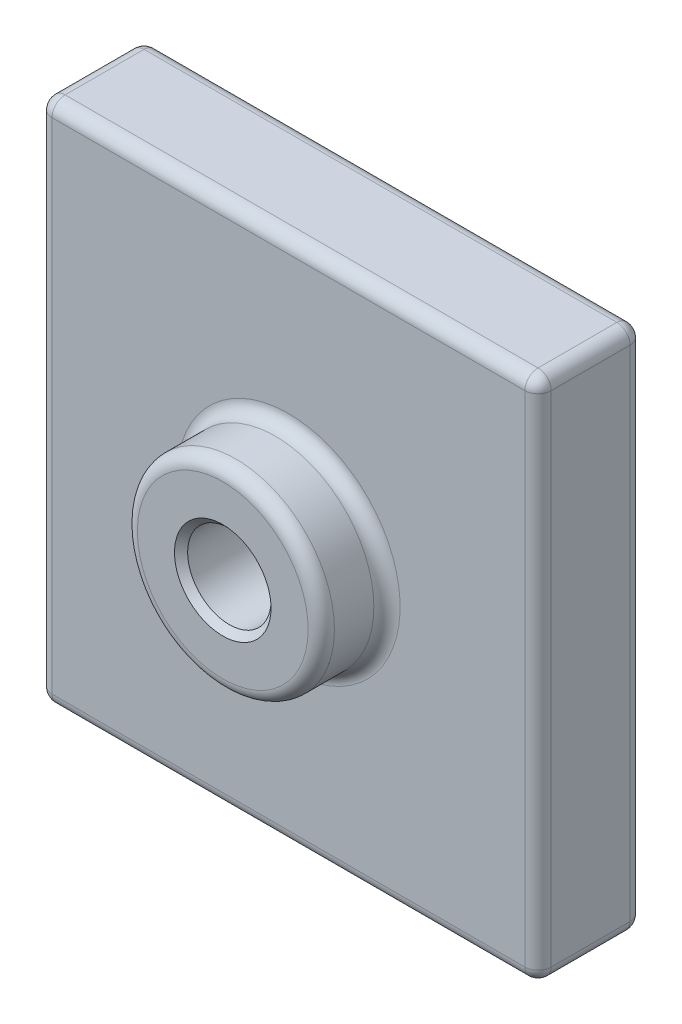
ISO-10303-21;
HEADER;
FILE_DESCRIPTION(('STEP AP214'),'2;1');
FILE_NAME('part.step','',(''),(''),'','','');
FILE_SCHEMA(('AUTOMOTIVE_DESIGN { 1 0 10303 214 1 1 1 1 }'));
ENDSEC;
DATA;
#1=APPLICATION_CONTEXT('core data for automotive mechanical design processes');
#2=APPLICATION_PROTOCOL_DEFINITION('international standard','automotive_design',2000,#1);
#3=PRODUCT_CONTEXT('',#1,'mechanical');
#4=PRODUCT('Part','Part','',(#3));
#5=PRODUCT_RELATED_PRODUCT_CATEGORY('part','',(#4));
#6=PRODUCT_DEFINITION_FORMATION('','',#4);
#7=PRODUCT_DEFINITION_CONTEXT('part definition',#1,'design');
#8=PRODUCT_DEFINITION('design','',#6,#7);
#9=PRODUCT_DEFINITION_SHAPE('','',#8);
#10=(LENGTH_UNIT() NAMED_UNIT(*) SI_UNIT(.MILLI.,.METRE.));
#11=(NAMED_UNIT(*) PLANE_ANGLE_UNIT() SI_UNIT($,.RADIAN.));
#12=(NAMED_UNIT(*) SI_UNIT($,.STERADIAN.) SOLID_ANGLE_UNIT());
#13=UNCERTAINTY_MEASURE_WITH_UNIT(LENGTH_MEASURE(1.E-05),#10,'distance_accuracy_value','');
#14=(GEOMETRIC_REPRESENTATION_CONTEXT(3) GLOBAL_UNCERTAINTY_ASSIGNED_CONTEXT((#13)) GLOBAL_UNIT_ASSIGNED_CONTEXT((#10,
#11,#12)) REPRESENTATION_CONTEXT('',''));
#15=CARTESIAN_POINT('',(0.,0.,0.));
#16=DIRECTION('',(0.,0.,1.));
#17=DIRECTION('',(1.,0.,0.));
#18=AXIS2_PLACEMENT_3D('',#15,#16,#17);
#19=CARTESIAN_POINT('',(0.,0.,8.));
#20=DIRECTION('',(1.,0.,0.));
#21=DIRECTION('',(0.,0.,-1.));
#22=AXIS2_PLACEMENT_3D('',#19,#20,#21);
#23=PLANE('',#22);
#24=DIRECTION('',(0.,0.,-1.));
#25=VECTOR('',#24,1.);
#26=CARTESIAN_POINT('',(0.,39.,8.));
#27=LINE('',#26,#25);
#28=CARTESIAN_POINT('',(0.,39.,7.));
#29=VERTEX_POINT('',#28);
#30=CARTESIAN_POINT('',(0.,39.,1.));
#31=VERTEX_POINT('',#30);
#32=EDGE_CURVE('E320',#29,#31,#27,.T.);
#33=ORIENTED_EDGE('',*,*,#32,.T.);
#34=DIRECTION('',(0.,-1.,0.));
#35=VECTOR('',#34,1.);
#36=CARTESIAN_POINT('',(0.,0.,1.));
#37=LINE('',#36,#35);
#38=CARTESIAN_POINT('',(0.,1.,1.));
#39=VERTEX_POINT('',#38);
#40=EDGE_CURVE('E324',#31,#39,#37,.T.);
#41=ORIENTED_EDGE('',*,*,#40,.T.);
#42=DIRECTION('',(0.,0.,-1.));
#43=VECTOR('',#42,1.);
#44=CARTESIAN_POINT('',(0.,1.,8.));
#45=LINE('',#44,#43);
#46=CARTESIAN_POINT('',(0.,1.,7.));
#47=VERTEX_POINT('',#46);
#48=EDGE_CURVE('E317',#39,#47,#45,.F.);
#49=ORIENTED_EDGE('',*,*,#48,.T.);
#50=DIRECTION('',(0.,-1.,0.));
#51=VECTOR('',#50,1.);
#52=CARTESIAN_POINT('',(0.,0.,7.));
#53=LINE('',#52,#51);
#54=EDGE_CURVE('E314',#47,#29,#53,.F.);
#55=ORIENTED_EDGE('',*,*,#54,.T.);
#56=EDGE_LOOP('',(#33,#41,#49,#55));
#57=FACE_BOUND('',#56,.T.);
#58=ADVANCED_FACE('F41',(#57),#23,.F.);
#59=CARTESIAN_POINT('',(0.,0.,8.));
#60=DIRECTION('',(0.,1.,0.));
#61=DIRECTION('',(0.,0.,1.));
#62=AXIS2_PLACEMENT_3D('',#59,#60,#61);
#63=PLANE('',#62);
#64=DIRECTION('',(0.,0.,-1.));
#65=VECTOR('',#64,1.);
#66=CARTESIAN_POINT('',(1.,0.,8.));
#67=LINE('',#66,#65);
#68=CARTESIAN_POINT('',(1.,0.,7.));
#69=VERTEX_POINT('',#68);
#70=CARTESIAN_POINT('',(1.,0.,1.));
#71=VERTEX_POINT('',#70);
#72=EDGE_CURVE('E265',#69,#71,#67,.T.);
#73=ORIENTED_EDGE('',*,*,#72,.T.);
#74=DIRECTION('',(1.,0.,0.));
#75=VECTOR('',#74,1.);
#76=CARTESIAN_POINT('',(38.,0.,1.));
#77=LINE('',#76,#75);
#78=CARTESIAN_POINT('',(37.,0.,1.));
#79=VERTEX_POINT('',#78);
#80=EDGE_CURVE('E271',#71,#79,#77,.T.);
#81=ORIENTED_EDGE('',*,*,#80,.T.);
#82=DIRECTION('',(0.,0.,-1.));
#83=VECTOR('',#82,1.);
#84=CARTESIAN_POINT('',(37.,0.,8.));
#85=LINE('',#84,#83);
#86=CARTESIAN_POINT('',(37.,0.,7.));
#87=VERTEX_POINT('',#86);
#88=EDGE_CURVE('E268',#79,#87,#85,.F.);
#89=ORIENTED_EDGE('',*,*,#88,.T.);
#90=DIRECTION('',(1.,0.,0.));
#91=VECTOR('',#90,1.);
#92=CARTESIAN_POINT('',(0.,0.,7.));
#93=LINE('',#92,#91);
#94=EDGE_CURVE('E262',#87,#69,#93,.F.);
#95=ORIENTED_EDGE('',*,*,#94,.T.);
#96=EDGE_LOOP('',(#73,#81,#89,#95));
#97=FACE_BOUND('',#96,.T.);
#98=ADVANCED_FACE('F536',(#97),#63,.F.);
#99=CARTESIAN_POINT('',(38.,0.,8.));
#100=DIRECTION('',(-1.,0.,0.));
#101=DIRECTION('',(0.,0.,1.));
#102=AXIS2_PLACEMENT_3D('',#99,#100,#101);
#103=PLANE('',#102);
#104=DIRECTION('',(0.,0.,-1.));
#105=VECTOR('',#104,1.);
#106=CARTESIAN_POINT('',(38.,1.,8.));
#107=LINE('',#106,#105);
#108=CARTESIAN_POINT('',(38.,1.,7.));
#109=VERTEX_POINT('',#108);
#110=CARTESIAN_POINT('',(38.,1.,1.));
#111=VERTEX_POINT('',#110);
#112=EDGE_CURVE('E307',#109,#111,#107,.T.);
#113=ORIENTED_EDGE('',*,*,#112,.T.);
#114=DIRECTION('',(0.,1.,0.));
#115=VECTOR('',#114,1.);
#116=CARTESIAN_POINT('',(38.,40.,1.));
#117=LINE('',#116,#115);
#118=CARTESIAN_POINT('',(38.,39.,1.));
#119=VERTEX_POINT('',#118);
#120=EDGE_CURVE('E311',#111,#119,#117,.T.);
#121=ORIENTED_EDGE('',*,*,#120,.T.);
#122=DIRECTION('',(0.,0.,-1.));
#123=VECTOR('',#122,1.);
#124=CARTESIAN_POINT('',(38.,39.,8.));
#125=LINE('',#124,#123);
#126=CARTESIAN_POINT('',(38.,39.,7.));
#127=VERTEX_POINT('',#126);
#128=EDGE_CURVE('E304',#119,#127,#125,.F.);
#129=ORIENTED_EDGE('',*,*,#128,.T.);
#130=DIRECTION('',(0.,1.,0.));
#131=VECTOR('',#130,1.);
#132=CARTESIAN_POINT('',(38.,0.,7.));
#133=LINE('',#132,#131);
#134=EDGE_CURVE('E301',#127,#109,#133,.F.);
#135=ORIENTED_EDGE('',*,*,#134,.T.);
#136=EDGE_LOOP('',(#113,#121,#129,#135));
#137=FACE_BOUND('',#136,.T.);
#138=ADVANCED_FACE('F542',(#137),#103,.F.);
#139=CARTESIAN_POINT('',(0.,40.,8.));
#140=DIRECTION('',(0.,-1.,0.));
#141=DIRECTION('',(0.,0.,-1.));
#142=AXIS2_PLACEMENT_3D('',#139,#140,#141);
#143=PLANE('',#142);
#144=DIRECTION('',(0.,0.,-1.));
#145=VECTOR('',#144,1.);
#146=CARTESIAN_POINT('',(37.,40.,8.));
#147=LINE('',#146,#145);
#148=CARTESIAN_POINT('',(37.,40.,7.));
#149=VERTEX_POINT('',#148);
#150=CARTESIAN_POINT('',(37.,40.,1.));
#151=VERTEX_POINT('',#150);
#152=EDGE_CURVE('E294',#149,#151,#147,.T.);
#153=ORIENTED_EDGE('',*,*,#152,.T.);
#154=DIRECTION('',(-1.,0.,0.));
#155=VECTOR('',#154,1.);
#156=CARTESIAN_POINT('',(0.,40.,1.));
#157=LINE('',#156,#155);
#158=CARTESIAN_POINT('',(1.,40.,1.));
#159=VERTEX_POINT('',#158);
#160=EDGE_CURVE('E297',#151,#159,#157,.T.);
#161=ORIENTED_EDGE('',*,*,#160,.T.);
#162=DIRECTION('',(0.,0.,-1.));
#163=VECTOR('',#162,1.);
#164=CARTESIAN_POINT('',(1.,40.,8.));
#165=LINE('',#164,#163);
#166=CARTESIAN_POINT('',(1.,40.,7.));
#167=VERTEX_POINT('',#166);
#168=EDGE_CURVE('E291',#159,#167,#165,.F.);
#169=ORIENTED_EDGE('',*,*,#168,.T.);
#170=DIRECTION('',(-1.,0.,0.));
#171=VECTOR('',#170,1.);
#172=CARTESIAN_POINT('',(0.,40.,7.));
#173=LINE('',#172,#171);
#174=EDGE_CURVE('E288',#167,#149,#173,.F.);
#175=ORIENTED_EDGE('',*,*,#174,.T.);
#176=EDGE_LOOP('',(#153,#161,#169,#175));
#177=FACE_BOUND('',#176,.T.);
#178=ADVANCED_FACE('F680',(#177),#143,.F.);
#179=CARTESIAN_POINT('',(0.,0.,8.));
#180=DIRECTION('',(0.,0.,-1.));
#181=DIRECTION('',(-1.,0.,0.));
#182=AXIS2_PLACEMENT_3D('',#179,#180,#181);
#183=PLANE('',#182);
#184=DIRECTION('',(0.,1.,0.));
#185=VECTOR('',#184,1.);
#186=CARTESIAN_POINT('',(37.,0.,8.));
#187=LINE('',#186,#185);
#188=CARTESIAN_POINT('',(37.,1.,8.));
#189=VERTEX_POINT('',#188);
#190=CARTESIAN_POINT('',(37.,39.,8.));
#191=VERTEX_POINT('',#190);
#192=EDGE_CURVE('E337',#189,#191,#187,.T.);
#193=ORIENTED_EDGE('',*,*,#192,.T.);
#194=DIRECTION('',(-1.,0.,0.));
#195=VECTOR('',#194,1.);
#196=CARTESIAN_POINT('',(0.,39.,8.));
#197=LINE('',#196,#195);
#198=CARTESIAN_POINT('',(1.,39.,8.));
#199=VERTEX_POINT('',#198);
#200=EDGE_CURVE('E340',#191,#199,#197,.T.);
#201=ORIENTED_EDGE('',*,*,#200,.T.);
#202=DIRECTION('',(0.,-1.,0.));
#203=VECTOR('',#202,1.);
#204=CARTESIAN_POINT('',(1.,0.,8.));
#205=LINE('',#204,#203);
#206=CARTESIAN_POINT('',(1.,1.,8.));
#207=VERTEX_POINT('',#206);
#208=EDGE_CURVE('E331',#199,#207,#205,.T.);
#209=ORIENTED_EDGE('',*,*,#208,.T.);
#210=DIRECTION('',(1.,0.,0.));
#211=VECTOR('',#210,1.);
#212=CARTESIAN_POINT('',(0.,1.,8.));
#213=LINE('',#212,#211);
#214=EDGE_CURVE('E334',#207,#189,#213,.T.);
#215=ORIENTED_EDGE('',*,*,#214,.T.);
#216=EDGE_LOOP('',(#193,#201,#209,#215));
#217=FACE_BOUND('',#216,.T.);
#218=CARTESIAN_POINT('',(19.,20.,8.));
#219=DIRECTION('',(0.,0.,-1.));
#220=DIRECTION('',(-1.,0.,0.));
#221=AXIS2_PLACEMENT_3D('',#218,#219,#220);
#222=CIRCLE('',#221,8.5);
#223=CARTESIAN_POINT('',(10.5,20.,8.));
#224=VERTEX_POINT('',#223);
#225=EDGE_CURVE('E327',#224,#224,#222,.T.);
#226=ORIENTED_EDGE('',*,*,#225,.T.);
#227=EDGE_LOOP('',(#226));
#228=FACE_BOUND('',#227,.T.);
#229=ADVANCED_FACE('F677',(#217,#228),#183,.F.);
#230=CARTESIAN_POINT('',(0.,0.,0.));
#231=DIRECTION('',(0.,0.,-1.));
#232=DIRECTION('',(-1.,0.,0.));
#233=AXIS2_PLACEMENT_3D('',#230,#231,#232);
#234=PLANE('',#233);
#235=DIRECTION('',(-0.5,0.866025403784439,0.));
#236=VECTOR('',#235,1.);
#237=CARTESIAN_POINT('',(22.6409151350771,25.80625,0.));
#238=LINE('',#237,#236);
#239=CARTESIAN_POINT('',(25.9931551355594,20.,0.));
#240=VERTEX_POINT('',#239);
#241=CARTESIAN_POINT('',(22.4965775677797,26.05625,0.));
#242=VERTEX_POINT('',#241);
#243=EDGE_CURVE('E449',#240,#242,#238,.T.);
#244=ORIENTED_EDGE('',*,*,#243,.T.);
#245=DIRECTION('',(-1.,0.,0.));
#246=VECTOR('',#245,1.);
#247=CARTESIAN_POINT('',(15.7920975668151,26.05625,0.));
#248=LINE('',#247,#246);
#249=CARTESIAN_POINT('',(15.5034224322203,26.05625,0.));
#250=VERTEX_POINT('',#249);
#251=EDGE_CURVE('E452',#242,#250,#248,.T.);
#252=ORIENTED_EDGE('',*,*,#251,.T.);
#253=DIRECTION('',(-0.5,-0.866025403784438,0.));
#254=VECTOR('',#253,1.);
#255=CARTESIAN_POINT('',(12.1511824317381,20.25,0.));
#256=LINE('',#255,#254);
#257=CARTESIAN_POINT('',(12.0068448644406,20.,0.));
#258=VERTEX_POINT('',#257);
#259=EDGE_CURVE('E437',#250,#258,#256,.T.);
#260=ORIENTED_EDGE('',*,*,#259,.T.);
#261=DIRECTION('',(0.5,-0.866025403784438,0.));
#262=VECTOR('',#261,1.);
#263=CARTESIAN_POINT('',(15.3590848649229,14.19375,0.));
#264=LINE('',#263,#262);
#265=CARTESIAN_POINT('',(15.5034224322203,13.94375,0.));
#266=VERTEX_POINT('',#265);
#267=EDGE_CURVE('E440',#258,#266,#264,.T.);
#268=ORIENTED_EDGE('',*,*,#267,.T.);
#269=DIRECTION('',(1.,0.,0.));
#270=VECTOR('',#269,1.);
#271=CARTESIAN_POINT('',(22.2079024331849,13.94375,0.));
#272=LINE('',#271,#270);
#273=CARTESIAN_POINT('',(22.4965775677797,13.94375,0.));
#274=VERTEX_POINT('',#273);
#275=EDGE_CURVE('E443',#266,#274,#272,.T.);
#276=ORIENTED_EDGE('',*,*,#275,.T.);
#277=DIRECTION('',(0.5,0.866025403784438,0.));
#278=VECTOR('',#277,1.);
#279=CARTESIAN_POINT('',(25.8488175682619,19.75,0.));
#280=LINE('',#279,#278);
#281=EDGE_CURVE('E446',#274,#240,#280,.T.);
#282=ORIENTED_EDGE('',*,*,#281,.T.);
#283=EDGE_LOOP('',(#244,#252,#260,#268,#276,#282));
#284=FACE_BOUND('',#283,.T.);
#285=DIRECTION('',(-1.,0.,0.));
#286=VECTOR('',#285,1.);
#287=CARTESIAN_POINT('',(38.,39.,0.));
#288=LINE('',#287,#286);
#289=CARTESIAN_POINT('',(1.,39.,0.));
#290=VERTEX_POINT('',#289);
#291=CARTESIAN_POINT('',(37.,39.,0.));
#292=VERTEX_POINT('',#291);
#293=EDGE_CURVE('E278',#290,#292,#288,.F.);
#294=ORIENTED_EDGE('',*,*,#293,.T.);
#295=DIRECTION('',(0.,1.,0.));
#296=VECTOR('',#295,1.);
#297=CARTESIAN_POINT('',(37.,0.,0.));
#298=LINE('',#297,#296);
#299=CARTESIAN_POINT('',(37.,1.,0.));
#300=VERTEX_POINT('',#299);
#301=EDGE_CURVE('E285',#292,#300,#298,.F.);
#302=ORIENTED_EDGE('',*,*,#301,.T.);
#303=DIRECTION('',(1.,0.,0.));
#304=VECTOR('',#303,1.);
#305=CARTESIAN_POINT('',(0.,1.,0.));
#306=LINE('',#305,#304);
#307=CARTESIAN_POINT('',(1.,1.,0.));
#308=VERTEX_POINT('',#307);
#309=EDGE_CURVE('E281',#300,#308,#306,.F.);
#310=ORIENTED_EDGE('',*,*,#309,.T.);
#311=DIRECTION('',(0.,-1.,0.));
#312=VECTOR('',#311,1.);
#313=CARTESIAN_POINT('',(1.,40.,0.));
#314=LINE('',#313,#312);
#315=EDGE_CURVE('E275',#308,#290,#314,.F.);
#316=ORIENTED_EDGE('',*,*,#315,.T.);
#317=EDGE_LOOP('',(#294,#302,#310,#316));
#318=FACE_BOUND('',#317,.T.);
#319=ADVANCED_FACE('F674',(#284,#318),#234,.T.);
#320=CARTESIAN_POINT('',(19.,20.,13.));
#321=DIRECTION('',(0.,0.,1.));
#322=DIRECTION('',(1.,0.,0.));
#323=AXIS2_PLACEMENT_3D('',#320,#321,#322);
#324=PLANE('',#323);
#325=CARTESIAN_POINT('',(19.,20.,13.));
#326=DIRECTION('',(0.,0.,1.));
#327=DIRECTION('',(1.,0.,0.));
#328=AXIS2_PLACEMENT_3D('',#325,#326,#327);
#329=CIRCLE('',#328,3.675);
#330=CARTESIAN_POINT('',(22.675,20.,13.));
#331=VERTEX_POINT('',#330);
#332=EDGE_CURVE('E51',#331,#331,#329,.F.);
#333=ORIENTED_EDGE('',*,*,#332,.T.);
#334=EDGE_LOOP('',(#333));
#335=FACE_BOUND('',#334,.T.);
#336=CARTESIAN_POINT('',(19.,20.,13.));
#337=DIRECTION('',(0.,0.,1.));
#338=DIRECTION('',(1.,0.,0.));
#339=AXIS2_PLACEMENT_3D('',#336,#337,#338);
#340=CIRCLE('',#339,6.5);
#341=CARTESIAN_POINT('',(25.5,20.,13.));
#342=VERTEX_POINT('',#341);
#343=EDGE_CURVE('E249',#342,#342,#340,.T.);
#344=ORIENTED_EDGE('',*,*,#343,.T.);
#345=EDGE_LOOP('',(#344));
#346=FACE_BOUND('',#345,.T.);
#347=ADVANCED_FACE('F668',(#335,#346),#324,.T.);
#348=CARTESIAN_POINT('',(19.,20.,13.));
#349=DIRECTION('',(0.,0.,-1.));
#350=DIRECTION('',(-1.,0.,0.));
#351=AXIS2_PLACEMENT_3D('',#348,#349,#350);
#352=CYLINDRICAL_SURFACE('',#351,7.5);
#353=CARTESIAN_POINT('',(19.,20.,12.));
#354=DIRECTION('',(0.,0.,1.));
#355=DIRECTION('',(1.,0.,0.));
#356=AXIS2_PLACEMENT_3D('',#353,#354,#355);
#357=CIRCLE('',#356,7.5);
#358=CARTESIAN_POINT('',(26.5,20.,12.));
#359=VERTEX_POINT('',#358);
#360=EDGE_CURVE('E258',#359,#359,#357,.F.);
#361=ORIENTED_EDGE('',*,*,#360,.T.);
#362=EDGE_LOOP('',(#361));
#363=FACE_BOUND('',#362,.T.);
#364=CARTESIAN_POINT('',(19.,20.,9.));
#365=DIRECTION('',(0.,0.,-1.));
#366=DIRECTION('',(-1.,0.,0.));
#367=AXIS2_PLACEMENT_3D('',#364,#365,#366);
#368=CIRCLE('',#367,7.5);
#369=CARTESIAN_POINT('',(11.5,20.,9.));
#370=VERTEX_POINT('',#369);
#371=EDGE_CURVE('E253',#370,#370,#368,.F.);
#372=ORIENTED_EDGE('',*,*,#371,.T.);
#373=EDGE_LOOP('',(#372));
#374=FACE_BOUND('',#373,.T.);
#375=ADVANCED_FACE('F661',(#363,#374),#352,.T.);
#376=CARTESIAN_POINT('',(19.,20.,13.));
#377=DIRECTION('',(0.,0.,-1.));
#378=DIRECTION('',(-1.,0.,0.));
#379=AXIS2_PLACEMENT_3D('',#376,#377,#378);
#380=CYLINDRICAL_SURFACE('',#379,3.175);
#381=CARTESIAN_POINT('',(19.,20.,12.5));
#382=DIRECTION('',(0.,0.,1.));
#383=DIRECTION('',(1.,0.,0.));
#384=AXIS2_PLACEMENT_3D('',#381,#382,#383);
#385=CIRCLE('',#384,3.175);
#386=CARTESIAN_POINT('',(22.175,20.,12.5));
#387=VERTEX_POINT('',#386);
#388=EDGE_CURVE('E472',#387,#387,#385,.T.);
#389=ORIENTED_EDGE('',*,*,#388,.T.);
#390=EDGE_LOOP('',(#389));
#391=FACE_BOUND('',#390,.T.);
#392=CARTESIAN_POINT('',(19.,20.,6.05624999999999));
#393=DIRECTION('',(0.,0.,-1.));
#394=DIRECTION('',(-1.,0.,0.));
#395=AXIS2_PLACEMENT_3D('',#392,#393,#394);
#396=CIRCLE('',#395,3.175);
#397=CARTESIAN_POINT('',(15.825,20.,6.05624999999999));
#398=VERTEX_POINT('',#397);
#399=EDGE_CURVE('E468',#398,#398,#396,.T.);
#400=ORIENTED_EDGE('',*,*,#399,.T.);
#401=EDGE_LOOP('',(#400));
#402=FACE_BOUND('',#401,.T.);
#403=ADVANCED_FACE('F551',(#391,#402),#380,.F.);
#404=CARTESIAN_POINT('',(19.,20.,12.));
#405=DIRECTION('',(0.,0.,1.));
#406=DIRECTION('',(1.,0.,0.));
#407=AXIS2_PLACEMENT_3D('',#404,#405,#406);
#408=TOROIDAL_SURFACE('',#407,6.5,1.);
#409=ORIENTED_EDGE('',*,*,#360,.F.);
#410=EDGE_LOOP('',(#409));
#411=FACE_BOUND('',#410,.T.);
#412=ORIENTED_EDGE('',*,*,#343,.F.);
#413=EDGE_LOOP('',(#412));
#414=FACE_BOUND('',#413,.T.);
#415=ADVANCED_FACE('F547',(#411,#414),#408,.T.);
#416=CARTESIAN_POINT('',(0.,39.,7.));
#417=DIRECTION('',(-1.,0.,0.));
#418=DIRECTION('',(0.,0.,1.));
#419=AXIS2_PLACEMENT_3D('',#416,#417,#418);
#420=CYLINDRICAL_SURFACE('',#419,1.);
#421=CARTESIAN_POINT('',(1.,39.,7.));
#422=DIRECTION('',(-1.,0.,0.));
#423=DIRECTION('',(0.,0.,1.));
#424=AXIS2_PLACEMENT_3D('',#421,#422,#423);
#425=CIRCLE('',#424,1.);
#426=EDGE_CURVE('E254',#199,#167,#425,.T.);
#427=ORIENTED_EDGE('',*,*,#426,.F.);
#428=ORIENTED_EDGE('',*,*,#200,.F.);
#429=CARTESIAN_POINT('',(37.,39.,7.));
#430=DIRECTION('',(1.,0.,0.));
#431=DIRECTION('',(0.,0.,-1.));
#432=AXIS2_PLACEMENT_3D('',#429,#430,#431);
#433=CIRCLE('',#432,1.);
#434=EDGE_CURVE('E428',#149,#191,#433,.T.);
#435=ORIENTED_EDGE('',*,*,#434,.F.);
#436=ORIENTED_EDGE('',*,*,#174,.F.);
#437=EDGE_LOOP('',(#427,#428,#435,#436));
#438=FACE_BOUND('',#437,.T.);
#439=ADVANCED_FACE('F550',(#438),#420,.T.);
#440=CARTESIAN_POINT('',(1.,39.,7.));
#441=DIRECTION('',(0.,0.,1.));
#442=DIRECTION('',(1.,0.,0.));
#443=AXIS2_PLACEMENT_3D('',#440,#441,#442);
#444=SPHERICAL_SURFACE('',#443,1.);
#445=CARTESIAN_POINT('',(1.,39.,7.));
#446=DIRECTION('',(0.,1.,0.));
#447=DIRECTION('',(0.,0.,1.));
#448=AXIS2_PLACEMENT_3D('',#445,#446,#447);
#449=CIRCLE('',#448,1.);
#450=EDGE_CURVE('E420',#199,#29,#449,.F.);
#451=ORIENTED_EDGE('',*,*,#450,.F.);
#452=ORIENTED_EDGE('',*,*,#426,.T.);
#453=CARTESIAN_POINT('',(1.,39.,7.));
#454=DIRECTION('',(0.,0.,1.));
#455=DIRECTION('',(1.,0.,0.));
#456=AXIS2_PLACEMENT_3D('',#453,#454,#455);
#457=CIRCLE('',#456,1.);
#458=EDGE_CURVE('E424',#29,#167,#457,.F.);
#459=ORIENTED_EDGE('',*,*,#458,.F.);
#460=EDGE_LOOP('',(#451,#452,#459));
#461=FACE_BOUND('',#460,.T.);
#462=ADVANCED_FACE('F624',(#461),#444,.T.);
#463=CARTESIAN_POINT('',(37.,39.,7.));
#464=DIRECTION('',(0.,0.,1.));
#465=DIRECTION('',(1.,0.,0.));
#466=AXIS2_PLACEMENT_3D('',#463,#464,#465);
#467=SPHERICAL_SURFACE('',#466,1.);
#468=CARTESIAN_POINT('',(37.,39.,7.));
#469=DIRECTION('',(0.,0.,1.));
#470=DIRECTION('',(1.,0.,0.));
#471=AXIS2_PLACEMENT_3D('',#468,#469,#470);
#472=CIRCLE('',#471,1.);
#473=EDGE_CURVE('E412',#149,#127,#472,.F.);
#474=ORIENTED_EDGE('',*,*,#473,.F.);
#475=ORIENTED_EDGE('',*,*,#434,.T.);
#476=CARTESIAN_POINT('',(37.,39.,7.));
#477=DIRECTION('',(0.,1.,0.));
#478=DIRECTION('',(0.,0.,1.));
#479=AXIS2_PLACEMENT_3D('',#476,#477,#478);
#480=CIRCLE('',#479,1.);
#481=EDGE_CURVE('E416',#127,#191,#480,.F.);
#482=ORIENTED_EDGE('',*,*,#481,.F.);
#483=EDGE_LOOP('',(#474,#475,#482));
#484=FACE_BOUND('',#483,.T.);
#485=ADVANCED_FACE('F620',(#484),#467,.T.);
#486=CARTESIAN_POINT('',(1.,39.,8.));
#487=DIRECTION('',(0.,0.,-1.));
#488=DIRECTION('',(-1.,0.,0.));
#489=AXIS2_PLACEMENT_3D('',#486,#487,#488);
#490=CYLINDRICAL_SURFACE('',#489,1.);
#491=ORIENTED_EDGE('',*,*,#458,.T.);
#492=ORIENTED_EDGE('',*,*,#168,.F.);
#493=CARTESIAN_POINT('',(1.,39.,1.));
#494=DIRECTION('',(0.,0.,-1.));
#495=DIRECTION('',(-1.,0.,0.));
#496=AXIS2_PLACEMENT_3D('',#493,#494,#495);
#497=CIRCLE('',#496,1.);
#498=EDGE_CURVE('E405',#31,#159,#497,.T.);
#499=ORIENTED_EDGE('',*,*,#498,.F.);
#500=ORIENTED_EDGE('',*,*,#32,.F.);
#501=EDGE_LOOP('',(#491,#492,#499,#500));
#502=FACE_BOUND('',#501,.T.);
#503=ADVANCED_FACE('F616',(#502),#490,.T.);
#504=CARTESIAN_POINT('',(1.,0.,7.));
#505=DIRECTION('',(0.,-1.,0.));
#506=DIRECTION('',(0.,0.,-1.));
#507=AXIS2_PLACEMENT_3D('',#504,#505,#506);
#508=CYLINDRICAL_SURFACE('',#507,1.);
#509=ORIENTED_EDGE('',*,*,#450,.T.);
#510=ORIENTED_EDGE('',*,*,#54,.F.);
#511=CARTESIAN_POINT('',(1.,1.,7.));
#512=DIRECTION('',(0.,-1.,0.));
#513=DIRECTION('',(0.,0.,-1.));
#514=AXIS2_PLACEMENT_3D('',#511,#512,#513);
#515=CIRCLE('',#514,1.);
#516=EDGE_CURVE('E401',#207,#47,#515,.T.);
#517=ORIENTED_EDGE('',*,*,#516,.F.);
#518=ORIENTED_EDGE('',*,*,#208,.F.);
#519=EDGE_LOOP('',(#509,#510,#517,#518));
#520=FACE_BOUND('',#519,.T.);
#521=ADVANCED_FACE('F612',(#520),#508,.T.);
#522=CARTESIAN_POINT('',(0.,1.,7.));
#523=DIRECTION('',(1.,0.,0.));
#524=DIRECTION('',(0.,0.,-1.));
#525=AXIS2_PLACEMENT_3D('',#522,#523,#524);
#526=CYLINDRICAL_SURFACE('',#525,1.);
#527=CARTESIAN_POINT('',(37.,1.,7.));
#528=DIRECTION('',(1.,0.,0.));
#529=DIRECTION('',(0.,0.,-1.));
#530=AXIS2_PLACEMENT_3D('',#527,#528,#529);
#531=CIRCLE('',#530,1.);
#532=EDGE_CURVE('E393',#189,#87,#531,.T.);
#533=ORIENTED_EDGE('',*,*,#532,.F.);
#534=ORIENTED_EDGE('',*,*,#214,.F.);
#535=CARTESIAN_POINT('',(1.,1.,7.));
#536=DIRECTION('',(-1.,0.,0.));
#537=DIRECTION('',(0.,0.,1.));
#538=AXIS2_PLACEMENT_3D('',#535,#536,#537);
#539=CIRCLE('',#538,1.);
#540=EDGE_CURVE('E397',#69,#207,#539,.T.);
#541=ORIENTED_EDGE('',*,*,#540,.F.);
#542=ORIENTED_EDGE('',*,*,#94,.F.);
#543=EDGE_LOOP('',(#533,#534,#541,#542));
#544=FACE_BOUND('',#543,.T.);
#545=ADVANCED_FACE('F608',(#544),#526,.T.);
#546=CARTESIAN_POINT('',(37.,0.,7.));
#547=DIRECTION('',(0.,1.,0.));
#548=DIRECTION('',(0.,0.,1.));
#549=AXIS2_PLACEMENT_3D('',#546,#547,#548);
#550=CYLINDRICAL_SURFACE('',#549,1.);
#551=ORIENTED_EDGE('',*,*,#481,.T.);
#552=ORIENTED_EDGE('',*,*,#192,.F.);
#553=CARTESIAN_POINT('',(37.,1.,7.));
#554=DIRECTION('',(0.,-1.,0.));
#555=DIRECTION('',(0.,0.,-1.));
#556=AXIS2_PLACEMENT_3D('',#553,#554,#555);
#557=CIRCLE('',#556,1.);
#558=EDGE_CURVE('E389',#109,#189,#557,.T.);
#559=ORIENTED_EDGE('',*,*,#558,.F.);
#560=ORIENTED_EDGE('',*,*,#134,.F.);
#561=EDGE_LOOP('',(#551,#552,#559,#560));
#562=FACE_BOUND('',#561,.T.);
#563=ADVANCED_FACE('F604',(#562),#550,.T.);
#564=CARTESIAN_POINT('',(37.,39.,8.));
#565=DIRECTION('',(0.,0.,-1.));
#566=DIRECTION('',(-1.,0.,0.));
#567=AXIS2_PLACEMENT_3D('',#564,#565,#566);
#568=CYLINDRICAL_SURFACE('',#567,1.);
#569=ORIENTED_EDGE('',*,*,#473,.T.);
#570=ORIENTED_EDGE('',*,*,#128,.F.);
#571=CARTESIAN_POINT('',(37.,39.,1.));
#572=DIRECTION('',(0.,0.,-1.));
#573=DIRECTION('',(-1.,0.,0.));
#574=AXIS2_PLACEMENT_3D('',#571,#572,#573);
#575=CIRCLE('',#574,1.);
#576=EDGE_CURVE('E385',#151,#119,#575,.T.);
#577=ORIENTED_EDGE('',*,*,#576,.F.);
#578=ORIENTED_EDGE('',*,*,#152,.F.);
#579=EDGE_LOOP('',(#569,#570,#577,#578));
#580=FACE_BOUND('',#579,.T.);
#581=ADVANCED_FACE('F600',(#580),#568,.T.);
#582=CARTESIAN_POINT('',(0.,39.,1.));
#583=DIRECTION('',(1.,0.,0.));
#584=DIRECTION('',(0.,0.,-1.));
#585=AXIS2_PLACEMENT_3D('',#582,#583,#584);
#586=CYLINDRICAL_SURFACE('',#585,1.);
#587=CARTESIAN_POINT('',(1.,39.,1.));
#588=DIRECTION('',(-1.,0.,0.));
#589=DIRECTION('',(0.,0.,1.));
#590=AXIS2_PLACEMENT_3D('',#587,#588,#589);
#591=CIRCLE('',#590,1.);
#592=EDGE_CURVE('E408',#159,#290,#591,.T.);
#593=ORIENTED_EDGE('',*,*,#592,.F.);
#594=ORIENTED_EDGE('',*,*,#160,.F.);
#595=CARTESIAN_POINT('',(37.,39.,1.));
#596=DIRECTION('',(1.,0.,0.));
#597=DIRECTION('',(0.,0.,-1.));
#598=AXIS2_PLACEMENT_3D('',#595,#596,#597);
#599=CIRCLE('',#598,1.);
#600=EDGE_CURVE('E381',#292,#151,#599,.T.);
#601=ORIENTED_EDGE('',*,*,#600,.F.);
#602=ORIENTED_EDGE('',*,*,#293,.F.);
#603=EDGE_LOOP('',(#593,#594,#601,#602));
#604=FACE_BOUND('',#603,.T.);
#605=ADVANCED_FACE('F596',(#604),#586,.T.);
#606=CARTESIAN_POINT('',(1.,39.,1.));
#607=DIRECTION('',(0.,0.,1.));
#608=DIRECTION('',(1.,0.,0.));
#609=AXIS2_PLACEMENT_3D('',#606,#607,#608);
#610=SPHERICAL_SURFACE('',#609,1.);
#611=ORIENTED_EDGE('',*,*,#498,.T.);
#612=ORIENTED_EDGE('',*,*,#592,.T.);
#613=CARTESIAN_POINT('',(1.,39.,1.));
#614=DIRECTION('',(0.,1.,0.));
#615=DIRECTION('',(0.,0.,1.));
#616=AXIS2_PLACEMENT_3D('',#613,#614,#615);
#617=CIRCLE('',#616,1.);
#618=EDGE_CURVE('E377',#31,#290,#617,.F.);
#619=ORIENTED_EDGE('',*,*,#618,.F.);
#620=EDGE_LOOP('',(#611,#612,#619));
#621=FACE_BOUND('',#620,.T.);
#622=ADVANCED_FACE('F592',(#621),#610,.T.);
#623=CARTESIAN_POINT('',(1.,1.,7.));
#624=DIRECTION('',(0.,0.,1.));
#625=DIRECTION('',(1.,0.,0.));
#626=AXIS2_PLACEMENT_3D('',#623,#624,#625);
#627=SPHERICAL_SURFACE('',#626,1.);
#628=ORIENTED_EDGE('',*,*,#540,.T.);
#629=ORIENTED_EDGE('',*,*,#516,.T.);
#630=CARTESIAN_POINT('',(1.,1.,7.));
#631=DIRECTION('',(0.,0.,1.));
#632=DIRECTION('',(1.,0.,0.));
#633=AXIS2_PLACEMENT_3D('',#630,#631,#632);
#634=CIRCLE('',#633,1.);
#635=EDGE_CURVE('E373',#69,#47,#634,.F.);
#636=ORIENTED_EDGE('',*,*,#635,.F.);
#637=EDGE_LOOP('',(#628,#629,#636));
#638=FACE_BOUND('',#637,.T.);
#639=ADVANCED_FACE('F588',(#638),#627,.T.);
#640=CARTESIAN_POINT('',(37.,1.,7.));
#641=DIRECTION('',(0.,0.,1.));
#642=DIRECTION('',(1.,0.,0.));
#643=AXIS2_PLACEMENT_3D('',#640,#641,#642);
#644=SPHERICAL_SURFACE('',#643,1.);
#645=ORIENTED_EDGE('',*,*,#558,.T.);
#646=ORIENTED_EDGE('',*,*,#532,.T.);
#647=CARTESIAN_POINT('',(37.,1.,7.));
#648=DIRECTION('',(0.,0.,1.));
#649=DIRECTION('',(1.,0.,0.));
#650=AXIS2_PLACEMENT_3D('',#647,#648,#649);
#651=CIRCLE('',#650,1.);
#652=EDGE_CURVE('E369',#109,#87,#651,.F.);
#653=ORIENTED_EDGE('',*,*,#652,.F.);
#654=EDGE_LOOP('',(#645,#646,#653));
#655=FACE_BOUND('',#654,.T.);
#656=ADVANCED_FACE('F584',(#655),#644,.T.);
#657=CARTESIAN_POINT('',(37.,39.,1.));
#658=DIRECTION('',(0.,0.,1.));
#659=DIRECTION('',(1.,0.,0.));
#660=AXIS2_PLACEMENT_3D('',#657,#658,#659);
#661=SPHERICAL_SURFACE('',#660,1.);
#662=ORIENTED_EDGE('',*,*,#600,.T.);
#663=ORIENTED_EDGE('',*,*,#576,.T.);
#664=CARTESIAN_POINT('',(37.,39.,1.));
#665=DIRECTION('',(0.,1.,0.));
#666=DIRECTION('',(0.,0.,1.));
#667=AXIS2_PLACEMENT_3D('',#664,#665,#666);
#668=CIRCLE('',#667,1.);
#669=EDGE_CURVE('E365',#292,#119,#668,.F.);
#670=ORIENTED_EDGE('',*,*,#669,.F.);
#671=EDGE_LOOP('',(#662,#663,#670));
#672=FACE_BOUND('',#671,.T.);
#673=ADVANCED_FACE('F580',(#672),#661,.T.);
#674=CARTESIAN_POINT('',(1.,0.,1.));
#675=DIRECTION('',(0.,1.,0.));
#676=DIRECTION('',(0.,0.,1.));
#677=AXIS2_PLACEMENT_3D('',#674,#675,#676);
#678=CYLINDRICAL_SURFACE('',#677,1.);
#679=ORIENTED_EDGE('',*,*,#618,.T.);
#680=ORIENTED_EDGE('',*,*,#315,.F.);
#681=CARTESIAN_POINT('',(1.,1.,1.));
#682=DIRECTION('',(0.,-1.,0.));
#683=DIRECTION('',(0.,0.,-1.));
#684=AXIS2_PLACEMENT_3D('',#681,#682,#683);
#685=CIRCLE('',#684,1.);
#686=EDGE_CURVE('E361',#39,#308,#685,.T.);
#687=ORIENTED_EDGE('',*,*,#686,.F.);
#688=ORIENTED_EDGE('',*,*,#40,.F.);
#689=EDGE_LOOP('',(#679,#680,#687,#688));
#690=FACE_BOUND('',#689,.T.);
#691=ADVANCED_FACE('F576',(#690),#678,.T.);
#692=CARTESIAN_POINT('',(1.,1.,8.));
#693=DIRECTION('',(0.,0.,-1.));
#694=DIRECTION('',(-1.,0.,0.));
#695=AXIS2_PLACEMENT_3D('',#692,#693,#694);
#696=CYLINDRICAL_SURFACE('',#695,1.);
#697=ORIENTED_EDGE('',*,*,#635,.T.);
#698=ORIENTED_EDGE('',*,*,#48,.F.);
#699=CARTESIAN_POINT('',(1.,1.,1.));
#700=DIRECTION('',(0.,0.,-1.));
#701=DIRECTION('',(-1.,0.,0.));
#702=AXIS2_PLACEMENT_3D('',#699,#700,#701);
#703=CIRCLE('',#702,1.);
#704=EDGE_CURVE('E357',#71,#39,#703,.T.);
#705=ORIENTED_EDGE('',*,*,#704,.F.);
#706=ORIENTED_EDGE('',*,*,#72,.F.);
#707=EDGE_LOOP('',(#697,#698,#705,#706));
#708=FACE_BOUND('',#707,.T.);
#709=ADVANCED_FACE('F572',(#708),#696,.T.);
#710=CARTESIAN_POINT('',(37.,1.,8.));
#711=DIRECTION('',(0.,0.,-1.));
#712=DIRECTION('',(-1.,0.,0.));
#713=AXIS2_PLACEMENT_3D('',#710,#711,#712);
#714=CYLINDRICAL_SURFACE('',#713,1.);
#715=ORIENTED_EDGE('',*,*,#652,.T.);
#716=ORIENTED_EDGE('',*,*,#88,.F.);
#717=CARTESIAN_POINT('',(37.,1.,1.));
#718=DIRECTION('',(0.,0.,-1.));
#719=DIRECTION('',(-1.,0.,0.));
#720=AXIS2_PLACEMENT_3D('',#717,#718,#719);
#721=CIRCLE('',#720,1.);
#722=EDGE_CURVE('E353',#111,#79,#721,.T.);
#723=ORIENTED_EDGE('',*,*,#722,.F.);
#724=ORIENTED_EDGE('',*,*,#112,.F.);
#725=EDGE_LOOP('',(#715,#716,#723,#724));
#726=FACE_BOUND('',#725,.T.);
#727=ADVANCED_FACE('F568',(#726),#714,.T.);
#728=CARTESIAN_POINT('',(37.,0.,1.));
#729=DIRECTION('',(0.,-1.,0.));
#730=DIRECTION('',(0.,0.,-1.));
#731=AXIS2_PLACEMENT_3D('',#728,#729,#730);
#732=CYLINDRICAL_SURFACE('',#731,1.);
#733=ORIENTED_EDGE('',*,*,#669,.T.);
#734=ORIENTED_EDGE('',*,*,#120,.F.);
#735=CARTESIAN_POINT('',(37.,1.,1.));
#736=DIRECTION('',(0.,-1.,0.));
#737=DIRECTION('',(0.,0.,-1.));
#738=AXIS2_PLACEMENT_3D('',#735,#736,#737);
#739=CIRCLE('',#738,1.);
#740=EDGE_CURVE('E350',#300,#111,#739,.T.);
#741=ORIENTED_EDGE('',*,*,#740,.F.);
#742=ORIENTED_EDGE('',*,*,#301,.F.);
#743=EDGE_LOOP('',(#733,#734,#741,#742));
#744=FACE_BOUND('',#743,.T.);
#745=ADVANCED_FACE('F564',(#744),#732,.T.);
#746=CARTESIAN_POINT('',(1.,1.,1.));
#747=DIRECTION('',(0.,0.,1.));
#748=DIRECTION('',(1.,0.,0.));
#749=AXIS2_PLACEMENT_3D('',#746,#747,#748);
#750=SPHERICAL_SURFACE('',#749,1.);
#751=ORIENTED_EDGE('',*,*,#704,.T.);
#752=ORIENTED_EDGE('',*,*,#686,.T.);
#753=CARTESIAN_POINT('',(1.,1.,1.));
#754=DIRECTION('',(-1.,0.,0.));
#755=DIRECTION('',(0.,0.,1.));
#756=AXIS2_PLACEMENT_3D('',#753,#754,#755);
#757=CIRCLE('',#756,1.);
#758=EDGE_CURVE('E347',#71,#308,#757,.F.);
#759=ORIENTED_EDGE('',*,*,#758,.F.);
#760=EDGE_LOOP('',(#751,#752,#759));
#761=FACE_BOUND('',#760,.T.);
#762=ADVANCED_FACE('F560',(#761),#750,.T.);
#763=CARTESIAN_POINT('',(37.,1.,1.));
#764=DIRECTION('',(0.,0.,1.));
#765=DIRECTION('',(1.,0.,0.));
#766=AXIS2_PLACEMENT_3D('',#763,#764,#765);
#767=SPHERICAL_SURFACE('',#766,1.);
#768=ORIENTED_EDGE('',*,*,#740,.T.);
#769=ORIENTED_EDGE('',*,*,#722,.T.);
#770=CARTESIAN_POINT('',(37.,1.,1.));
#771=DIRECTION('',(1.,0.,0.));
#772=DIRECTION('',(0.,0.,-1.));
#773=AXIS2_PLACEMENT_3D('',#770,#771,#772);
#774=CIRCLE('',#773,1.);
#775=EDGE_CURVE('E236',#300,#79,#774,.F.);
#776=ORIENTED_EDGE('',*,*,#775,.F.);
#777=EDGE_LOOP('',(#768,#769,#776));
#778=FACE_BOUND('',#777,.T.);
#779=ADVANCED_FACE('F556',(#778),#767,.T.);
#780=CARTESIAN_POINT('',(0.,1.,1.));
#781=DIRECTION('',(-1.,0.,0.));
#782=DIRECTION('',(0.,0.,1.));
#783=AXIS2_PLACEMENT_3D('',#780,#781,#782);
#784=CYLINDRICAL_SURFACE('',#783,1.);
#785=ORIENTED_EDGE('',*,*,#758,.T.);
#786=ORIENTED_EDGE('',*,*,#309,.F.);
#787=ORIENTED_EDGE('',*,*,#775,.T.);
#788=ORIENTED_EDGE('',*,*,#80,.F.);
#789=EDGE_LOOP('',(#785,#786,#787,#788));
#790=FACE_BOUND('',#789,.T.);
#791=ADVANCED_FACE('F553',(#790),#784,.T.);
#792=CARTESIAN_POINT('',(19.,20.,9.));
#793=DIRECTION('',(0.,0.,-1.));
#794=DIRECTION('',(-1.,0.,0.));
#795=AXIS2_PLACEMENT_3D('',#792,#793,#794);
#796=TOROIDAL_SURFACE('',#795,8.5,1.);
#797=ORIENTED_EDGE('',*,*,#225,.F.);
#798=EDGE_LOOP('',(#797));
#799=FACE_BOUND('',#798,.T.);
#800=ORIENTED_EDGE('',*,*,#371,.F.);
#801=EDGE_LOOP('',(#800));
#802=FACE_BOUND('',#801,.T.);
#803=ADVANCED_FACE('F532',(#799,#802),#796,.F.);
#804=CARTESIAN_POINT('',(12.5841951336303,20.,5.55625));
#805=DIRECTION('',(-0.866025403784438,0.5,0.));
#806=DIRECTION('',(-0.5,-0.866025403784438,0.));
#807=AXIS2_PLACEMENT_3D('',#804,#805,#806);
#808=PLANE('',#807);
#809=DIRECTION('',(0.,0.,-1.));
#810=VECTOR('',#809,1.);
#811=CARTESIAN_POINT('',(12.5841951336303,20.,5.55625));
#812=LINE('',#811,#810);
#813=CARTESIAN_POINT('',(12.5841951336303,20.,5.55625));
#814=VERTEX_POINT('',#813);
#815=CARTESIAN_POINT('',(12.5841951336303,20.,0.5));
#816=VERTEX_POINT('',#815);
#817=EDGE_CURVE('E233',#814,#816,#812,.T.);
#818=ORIENTED_EDGE('',*,*,#817,.T.);
#819=DIRECTION('',(0.5,0.866025403784438,0.));
#820=VECTOR('',#819,1.);
#821=CARTESIAN_POINT('',(15.7920975668151,25.55625,0.500000000000001));
#822=LINE('',#821,#820);
#823=CARTESIAN_POINT('',(15.7920975668151,25.55625,0.5));
#824=VERTEX_POINT('',#823);
#825=EDGE_CURVE('E195',#816,#824,#822,.T.);
#826=ORIENTED_EDGE('',*,*,#825,.T.);
#827=DIRECTION('',(0.,0.,-1.));
#828=VECTOR('',#827,1.);
#829=CARTESIAN_POINT('',(15.7920975668151,25.55625,5.55625));
#830=LINE('',#829,#828);
#831=CARTESIAN_POINT('',(15.7920975668151,25.55625,5.55625));
#832=VERTEX_POINT('',#831);
#833=EDGE_CURVE('E188',#832,#824,#830,.T.);
#834=ORIENTED_EDGE('',*,*,#833,.F.);
#835=DIRECTION('',(0.500000000000001,0.866025403784438,0.));
#836=VECTOR('',#835,1.);
#837=CARTESIAN_POINT('',(12.5841951336303,20.,5.55625));
#838=LINE('',#837,#836);
#839=EDGE_CURVE('E192',#814,#832,#838,.T.);
#840=ORIENTED_EDGE('',*,*,#839,.F.);
#841=EDGE_LOOP('',(#818,#826,#834,#840));
#842=FACE_BOUND('',#841,.T.);
#843=ADVANCED_FACE('F190',(#842),#808,.F.);
#844=CARTESIAN_POINT('',(15.7920975668151,14.44375,5.55625));
#845=DIRECTION('',(-0.866025403784438,-0.5,0.));
#846=DIRECTION('',(0.5,-0.866025403784438,0.));
#847=AXIS2_PLACEMENT_3D('',#844,#845,#846);
#848=PLANE('',#847);
#849=DIRECTION('',(0.,0.,-1.));
#850=VECTOR('',#849,1.);
#851=CARTESIAN_POINT('',(15.7920975668151,14.44375,5.55625));
#852=LINE('',#851,#850);
#853=CARTESIAN_POINT('',(15.7920975668151,14.44375,5.55625));
#854=VERTEX_POINT('',#853);
#855=CARTESIAN_POINT('',(15.7920975668151,14.44375,0.5));
#856=VERTEX_POINT('',#855);
#857=EDGE_CURVE('E237',#854,#856,#852,.T.);
#858=ORIENTED_EDGE('',*,*,#857,.T.);
#859=DIRECTION('',(-0.5,0.866025403784438,0.));
#860=VECTOR('',#859,1.);
#861=CARTESIAN_POINT('',(12.5841951336303,20.,0.5));
#862=LINE('',#861,#860);
#863=EDGE_CURVE('E59',#856,#816,#862,.T.);
#864=ORIENTED_EDGE('',*,*,#863,.T.);
#865=ORIENTED_EDGE('',*,*,#817,.F.);
#866=DIRECTION('',(-0.500000000000001,0.866025403784438,0.));
#867=VECTOR('',#866,1.);
#868=CARTESIAN_POINT('',(15.7920975668151,14.44375,5.55625));
#869=LINE('',#868,#867);
#870=EDGE_CURVE('E201',#854,#814,#869,.T.);
#871=ORIENTED_EDGE('',*,*,#870,.F.);
#872=EDGE_LOOP('',(#858,#864,#865,#871));
#873=FACE_BOUND('',#872,.T.);
#874=ADVANCED_FACE('F524',(#873),#848,.F.);
#875=CARTESIAN_POINT('',(22.2079024331849,14.44375,5.55625));
#876=DIRECTION('',(0.,-1.,0.));
#877=DIRECTION('',(1.,0.,0.));
#878=AXIS2_PLACEMENT_3D('',#875,#876,#877);
#879=PLANE('',#878);
#880=DIRECTION('',(0.,0.,-1.));
#881=VECTOR('',#880,1.);
#882=CARTESIAN_POINT('',(22.2079024331849,14.44375,5.55625));
#883=LINE('',#882,#881);
#884=CARTESIAN_POINT('',(22.2079024331849,14.44375,5.55625));
#885=VERTEX_POINT('',#884);
#886=CARTESIAN_POINT('',(22.2079024331849,14.44375,0.5));
#887=VERTEX_POINT('',#886);
#888=EDGE_CURVE('E240',#885,#887,#883,.T.);
#889=ORIENTED_EDGE('',*,*,#888,.T.);
#890=DIRECTION('',(-1.,0.,0.));
#891=VECTOR('',#890,1.);
#892=CARTESIAN_POINT('',(15.7920975668151,14.44375,0.5));
#893=LINE('',#892,#891);
#894=EDGE_CURVE('E67',#887,#856,#893,.T.);
#895=ORIENTED_EDGE('',*,*,#894,.T.);
#896=ORIENTED_EDGE('',*,*,#857,.F.);
#897=DIRECTION('',(-1.,0.,0.));
#898=VECTOR('',#897,1.);
#899=CARTESIAN_POINT('',(22.2079024331849,14.44375,5.55625));
#900=LINE('',#899,#898);
#901=EDGE_CURVE('E228',#885,#854,#900,.T.);
#902=ORIENTED_EDGE('',*,*,#901,.F.);
#903=EDGE_LOOP('',(#889,#895,#896,#902));
#904=FACE_BOUND('',#903,.T.);
#905=ADVANCED_FACE('F523',(#904),#879,.F.);
#906=CARTESIAN_POINT('',(25.4158048663697,20.,5.55625));
#907=DIRECTION('',(0.866025403784438,-0.5,0.));
#908=DIRECTION('',(0.5,0.866025403784439,0.));
#909=AXIS2_PLACEMENT_3D('',#906,#907,#908);
#910=PLANE('',#909);
#911=DIRECTION('',(0.,0.,-1.));
#912=VECTOR('',#911,1.);
#913=CARTESIAN_POINT('',(25.4158048663697,20.,5.55625));
#914=LINE('',#913,#912);
#915=CARTESIAN_POINT('',(25.4158048663697,20.,5.55625));
#916=VERTEX_POINT('',#915);
#917=CARTESIAN_POINT('',(25.4158048663697,20.,0.5));
#918=VERTEX_POINT('',#917);
#919=EDGE_CURVE('E243',#916,#918,#914,.T.);
#920=ORIENTED_EDGE('',*,*,#919,.T.);
#921=DIRECTION('',(-0.5,-0.866025403784439,0.));
#922=VECTOR('',#921,1.);
#923=CARTESIAN_POINT('',(22.2079024331849,14.44375,0.5));
#924=LINE('',#923,#922);
#925=EDGE_CURVE('E459',#918,#887,#924,.T.);
#926=ORIENTED_EDGE('',*,*,#925,.T.);
#927=ORIENTED_EDGE('',*,*,#888,.F.);
#928=DIRECTION('',(-0.5,-0.866025403784438,0.));
#929=VECTOR('',#928,1.);
#930=CARTESIAN_POINT('',(25.4158048663697,20.,5.55625));
#931=LINE('',#930,#929);
#932=EDGE_CURVE('E224',#916,#885,#931,.T.);
#933=ORIENTED_EDGE('',*,*,#932,.F.);
#934=EDGE_LOOP('',(#920,#926,#927,#933));
#935=FACE_BOUND('',#934,.T.);
#936=ADVANCED_FACE('F522',(#935),#910,.F.);
#937=CARTESIAN_POINT('',(22.2079024331849,25.55625,5.55625));
#938=DIRECTION('',(0.866025403784439,0.5,0.));
#939=DIRECTION('',(-0.5,0.866025403784439,0.));
#940=AXIS2_PLACEMENT_3D('',#937,#938,#939);
#941=PLANE('',#940);
#942=DIRECTION('',(0.,0.,-1.));
#943=VECTOR('',#942,1.);
#944=CARTESIAN_POINT('',(22.2079024331849,25.55625,5.55625));
#945=LINE('',#944,#943);
#946=CARTESIAN_POINT('',(22.2079024331849,25.55625,5.55625));
#947=VERTEX_POINT('',#946);
#948=CARTESIAN_POINT('',(22.2079024331849,25.55625,0.5));
#949=VERTEX_POINT('',#948);
#950=EDGE_CURVE('E200',#947,#949,#945,.T.);
#951=ORIENTED_EDGE('',*,*,#950,.T.);
#952=DIRECTION('',(0.5,-0.866025403784439,0.));
#953=VECTOR('',#952,1.);
#954=CARTESIAN_POINT('',(25.4158048663697,20.,0.5));
#955=LINE('',#954,#953);
#956=EDGE_CURVE('E456',#949,#918,#955,.T.);
#957=ORIENTED_EDGE('',*,*,#956,.T.);
#958=ORIENTED_EDGE('',*,*,#919,.F.);
#959=DIRECTION('',(0.5,-0.866025403784438,0.));
#960=VECTOR('',#959,1.);
#961=CARTESIAN_POINT('',(22.2079024331849,25.55625,5.55625));
#962=LINE('',#961,#960);
#963=EDGE_CURVE('E211',#947,#916,#962,.T.);
#964=ORIENTED_EDGE('',*,*,#963,.F.);
#965=EDGE_LOOP('',(#951,#957,#958,#964));
#966=FACE_BOUND('',#965,.T.);
#967=ADVANCED_FACE('F518',(#966),#941,.F.);
#968=CARTESIAN_POINT('',(15.7920975668151,25.55625,5.55625));
#969=DIRECTION('',(0.,1.,0.));
#970=DIRECTION('',(0.,0.,1.));
#971=AXIS2_PLACEMENT_3D('',#968,#969,#970);
#972=PLANE('',#971);
#973=ORIENTED_EDGE('',*,*,#833,.T.);
#974=DIRECTION('',(1.,0.,0.));
#975=VECTOR('',#974,1.);
#976=CARTESIAN_POINT('',(22.2079024331849,25.55625,0.5));
#977=LINE('',#976,#975);
#978=EDGE_CURVE('E344',#824,#949,#977,.T.);
#979=ORIENTED_EDGE('',*,*,#978,.T.);
#980=ORIENTED_EDGE('',*,*,#950,.F.);
#981=DIRECTION('',(1.,0.,0.));
#982=VECTOR('',#981,1.);
#983=CARTESIAN_POINT('',(15.7920975668151,25.55625,5.55625));
#984=LINE('',#983,#982);
#985=EDGE_CURVE('E204',#832,#947,#984,.T.);
#986=ORIENTED_EDGE('',*,*,#985,.F.);
#987=EDGE_LOOP('',(#973,#979,#980,#986));
#988=FACE_BOUND('',#987,.T.);
#989=ADVANCED_FACE('F205',(#988),#972,.F.);
#990=CARTESIAN_POINT('',(0.,0.,5.55625));
#991=DIRECTION('',(0.,0.,-1.));
#992=DIRECTION('',(-1.,0.,0.));
#993=AXIS2_PLACEMENT_3D('',#990,#991,#992);
#994=PLANE('',#993);
#995=CARTESIAN_POINT('',(19.,20.,5.55625));
#996=DIRECTION('',(0.,0.,-1.));
#997=DIRECTION('',(-1.,0.,0.));
#998=AXIS2_PLACEMENT_3D('',#995,#996,#997);
#999=CIRCLE('',#998,3.67499999999999);
#1000=CARTESIAN_POINT('',(15.325,20.,5.55625));
#1001=VERTEX_POINT('',#1000);
#1002=EDGE_CURVE('E12',#1001,#1001,#999,.F.);
#1003=ORIENTED_EDGE('',*,*,#1002,.T.);
#1004=EDGE_LOOP('',(#1003));
#1005=FACE_BOUND('',#1004,.T.);
#1006=ORIENTED_EDGE('',*,*,#839,.T.);
#1007=ORIENTED_EDGE('',*,*,#985,.T.);
#1008=ORIENTED_EDGE('',*,*,#963,.T.);
#1009=ORIENTED_EDGE('',*,*,#932,.T.);
#1010=ORIENTED_EDGE('',*,*,#901,.T.);
#1011=ORIENTED_EDGE('',*,*,#870,.T.);
#1012=EDGE_LOOP('',(#1006,#1007,#1008,#1009,#1010,#1011));
#1013=FACE_BOUND('',#1012,.T.);
#1014=ADVANCED_FACE('F213',(#1005,#1013),#994,.T.);
#1015=CARTESIAN_POINT('',(22.2079024331849,14.44375,0.5));
#1016=DIRECTION('',(0.,0.707106781186541,-0.707106781186554));
#1017=DIRECTION('',(1.,0.,0.));
#1018=AXIS2_PLACEMENT_3D('',#1015,#1016,#1017);
#1019=PLANE('',#1018);
#1020=DIRECTION('',(0.377964473009233,-0.654653670707981,-0.654653670707969));
#1021=VECTOR('',#1020,1.);
#1022=CARTESIAN_POINT('',(21.2913588808463,16.03125,2.08749999999998));
#1023=LINE('',#1022,#1021);
#1024=EDGE_CURVE('E220',#274,#887,#1023,.F.);
#1025=ORIENTED_EDGE('',*,*,#1024,.F.);
#1026=ORIENTED_EDGE('',*,*,#275,.F.);
#1027=DIRECTION('',(-0.377964473009233,-0.654653670707982,-0.654653670707969));
#1028=VECTOR('',#1027,1.);
#1029=CARTESIAN_POINT('',(16.7086411191537,16.03125,2.0875));
#1030=LINE('',#1029,#1028);
#1031=EDGE_CURVE('E45',#856,#266,#1030,.T.);
#1032=ORIENTED_EDGE('',*,*,#1031,.F.);
#1033=ORIENTED_EDGE('',*,*,#894,.F.);
#1034=EDGE_LOOP('',(#1025,#1026,#1032,#1033));
#1035=FACE_BOUND('',#1034,.T.);
#1036=ADVANCED_FACE('F502',(#1035),#1019,.T.);
#1037=CARTESIAN_POINT('',(15.7920975668151,14.44375,0.5));
#1038=DIRECTION('',(0.612372435695787,0.35355339059327,-0.707106781186556));
#1039=DIRECTION('',(0.5,-0.866025403784438,0.));
#1040=AXIS2_PLACEMENT_3D('',#1037,#1038,#1039);
#1041=PLANE('',#1040);
#1042=ORIENTED_EDGE('',*,*,#1031,.T.);
#1043=ORIENTED_EDGE('',*,*,#267,.F.);
#1044=DIRECTION('',(-0.755928946018461,0.,-0.654653670707969));
#1045=VECTOR('',#1044,1.);
#1046=CARTESIAN_POINT('',(14.4172822383074,20.,2.08749999999998));
#1047=LINE('',#1046,#1045);
#1048=EDGE_CURVE('E489',#816,#258,#1047,.T.);
#1049=ORIENTED_EDGE('',*,*,#1048,.F.);
#1050=ORIENTED_EDGE('',*,*,#863,.F.);
#1051=EDGE_LOOP('',(#1042,#1043,#1049,#1050));
#1052=FACE_BOUND('',#1051,.T.);
#1053=ADVANCED_FACE('F507',(#1052),#1041,.T.);
#1054=CARTESIAN_POINT('',(25.4158048663697,20.,0.5));
#1055=DIRECTION('',(-0.612372435695787,0.35355339059327,-0.707106781186556));
#1056=DIRECTION('',(0.5,0.866025403784439,0.));
#1057=AXIS2_PLACEMENT_3D('',#1054,#1055,#1056);
#1058=PLANE('',#1057);
#1059=ORIENTED_EDGE('',*,*,#1024,.T.);
#1060=ORIENTED_EDGE('',*,*,#925,.F.);
#1061=DIRECTION('',(0.755928946018462,0.,-0.654653670707969));
#1062=VECTOR('',#1061,1.);
#1063=CARTESIAN_POINT('',(23.5827177616926,20.,2.08750000000001));
#1064=LINE('',#1063,#1062);
#1065=EDGE_CURVE('E485',#240,#918,#1064,.F.);
#1066=ORIENTED_EDGE('',*,*,#1065,.F.);
#1067=ORIENTED_EDGE('',*,*,#281,.F.);
#1068=EDGE_LOOP('',(#1059,#1060,#1066,#1067));
#1069=FACE_BOUND('',#1068,.T.);
#1070=ADVANCED_FACE('F498',(#1069),#1058,.T.);
#1071=CARTESIAN_POINT('',(12.5841951336303,20.,0.5));
#1072=DIRECTION('',(0.612372435695789,-0.353553390593271,-0.707106781186554));
#1073=DIRECTION('',(-0.5,-0.866025403784438,0.));
#1074=AXIS2_PLACEMENT_3D('',#1071,#1072,#1073);
#1075=PLANE('',#1074);
#1076=ORIENTED_EDGE('',*,*,#1048,.T.);
#1077=ORIENTED_EDGE('',*,*,#259,.F.);
#1078=DIRECTION('',(0.377964473009228,-0.654653670707984,0.65465367070797));
#1079=VECTOR('',#1078,1.);
#1080=CARTESIAN_POINT('',(15.7920975668151,25.55625,0.5));
#1081=LINE('',#1080,#1079);
#1082=EDGE_CURVE('E482',#824,#250,#1081,.F.);
#1083=ORIENTED_EDGE('',*,*,#1082,.F.);
#1084=ORIENTED_EDGE('',*,*,#825,.F.);
#1085=EDGE_LOOP('',(#1076,#1077,#1083,#1084));
#1086=FACE_BOUND('',#1085,.T.);
#1087=ADVANCED_FACE('F510',(#1086),#1075,.T.);
#1088=CARTESIAN_POINT('',(22.2079024331849,25.55625,0.5));
#1089=DIRECTION('',(-0.612372435695789,-0.35355339059327,-0.707106781186554));
#1090=DIRECTION('',(-0.5,0.866025403784439,0.));
#1091=AXIS2_PLACEMENT_3D('',#1088,#1089,#1090);
#1092=PLANE('',#1091);
#1093=ORIENTED_EDGE('',*,*,#1065,.T.);
#1094=ORIENTED_EDGE('',*,*,#956,.F.);
#1095=DIRECTION('',(0.377964473009229,0.654653670707983,-0.65465367070797));
#1096=VECTOR('',#1095,1.);
#1097=CARTESIAN_POINT('',(21.2913588808463,23.96875,2.08749999999999));
#1098=LINE('',#1097,#1096);
#1099=EDGE_CURVE('E479',#242,#949,#1098,.F.);
#1100=ORIENTED_EDGE('',*,*,#1099,.F.);
#1101=ORIENTED_EDGE('',*,*,#243,.F.);
#1102=EDGE_LOOP('',(#1093,#1094,#1100,#1101));
#1103=FACE_BOUND('',#1102,.T.);
#1104=ADVANCED_FACE('F638',(#1103),#1092,.T.);
#1105=CARTESIAN_POINT('',(15.7920975668151,25.55625,0.5));
#1106=DIRECTION('',(0.,-0.70710678118654,-0.707106781186555));
#1107=DIRECTION('',(-1.,0.,0.));
#1108=AXIS2_PLACEMENT_3D('',#1105,#1106,#1107);
#1109=PLANE('',#1108);
#1110=ORIENTED_EDGE('',*,*,#1082,.T.);
#1111=ORIENTED_EDGE('',*,*,#251,.F.);
#1112=ORIENTED_EDGE('',*,*,#1099,.T.);
#1113=ORIENTED_EDGE('',*,*,#978,.F.);
#1114=EDGE_LOOP('',(#1110,#1111,#1112,#1113));
#1115=FACE_BOUND('',#1114,.T.);
#1116=ADVANCED_FACE('F514',(#1115),#1109,.T.);
#1117=CARTESIAN_POINT('',(19.,20.,12.5));
#1118=DIRECTION('',(0.,0.,1.));
#1119=DIRECTION('',(1.,0.,0.));
#1120=AXIS2_PLACEMENT_3D('',#1117,#1118,#1119);
#1121=CONICAL_SURFACE('',#1120,3.175,0.785398163397451);
#1122=ORIENTED_EDGE('',*,*,#332,.F.);
#1123=EDGE_LOOP('',(#1122));
#1124=FACE_BOUND('',#1123,.T.);
#1125=ORIENTED_EDGE('',*,*,#388,.F.);
#1126=EDGE_LOOP('',(#1125));
#1127=FACE_BOUND('',#1126,.T.);
#1128=ADVANCED_FACE('F637',(#1124,#1127),#1121,.F.);
#1129=CARTESIAN_POINT('',(19.,20.,6.05624999999999));
#1130=DIRECTION('',(0.,0.,-1.));
#1131=DIRECTION('',(-1.,0.,0.));
#1132=AXIS2_PLACEMENT_3D('',#1129,#1130,#1131);
#1133=CONICAL_SURFACE('',#1132,3.175,0.785398163397445);
#1134=ORIENTED_EDGE('',*,*,#1002,.F.);
#1135=EDGE_LOOP('',(#1134));
#1136=FACE_BOUND('',#1135,.T.);
#1137=ORIENTED_EDGE('',*,*,#399,.F.);
#1138=EDGE_LOOP('',(#1137));
#1139=FACE_BOUND('',#1138,.T.);
#1140=ADVANCED_FACE('F43',(#1136,#1139),#1133,.F.);
#1141=CLOSED_SHELL('',(#58,#98,#138,#178,#229,#319,#347,#375,#403,#415,#439,#462,#485,#503,#521,
#545,#563,#581,#605,#622,#639,#656,#673,#691,#709,#727,#745,#762,#779,#791,#803,#843,#874,#905,
#936,#967,#989,#1014,#1036,#1053,#1070,#1087,#1104,#1116,#1128,#1140));
#1142=MANIFOLD_SOLID_BREP('B2',#1141);
#1143=ADVANCED_BREP_SHAPE_REPRESENTATION('',(#18,#1142),#14);
#1144=SHAPE_DEFINITION_REPRESENTATION(#9,#1143);
ENDSEC;
END-ISO-10303-21;
